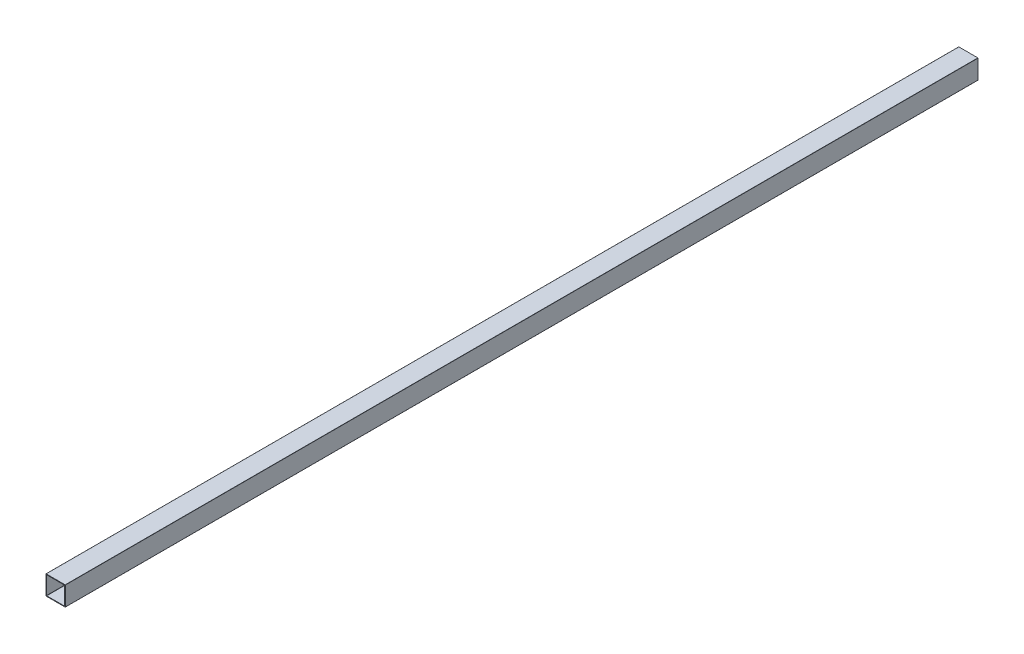
ISO-10303-21;
HEADER;
FILE_DESCRIPTION(('STEP AP214'),'2;1');
FILE_NAME('part.step','',(''),(''),'','','');
FILE_SCHEMA(('AUTOMOTIVE_DESIGN { 1 0 10303 214 1 1 1 1 }'));
ENDSEC;
DATA;
#1=APPLICATION_CONTEXT('core data for automotive mechanical design processes');
#2=APPLICATION_PROTOCOL_DEFINITION('international standard','automotive_design',2000,#1);
#3=PRODUCT_CONTEXT('',#1,'mechanical');
#4=PRODUCT('Part','Part','',(#3));
#5=PRODUCT_RELATED_PRODUCT_CATEGORY('part','',(#4));
#6=PRODUCT_DEFINITION_FORMATION('','',#4);
#7=PRODUCT_DEFINITION_CONTEXT('part definition',#1,'design');
#8=PRODUCT_DEFINITION('design','',#6,#7);
#9=PRODUCT_DEFINITION_SHAPE('','',#8);
#10=(LENGTH_UNIT() NAMED_UNIT(*) SI_UNIT(.MILLI.,.METRE.));
#11=(NAMED_UNIT(*) PLANE_ANGLE_UNIT() SI_UNIT($,.RADIAN.));
#12=(NAMED_UNIT(*) SI_UNIT($,.STERADIAN.) SOLID_ANGLE_UNIT());
#13=UNCERTAINTY_MEASURE_WITH_UNIT(LENGTH_MEASURE(1.E-05),#10,'distance_accuracy_value','');
#14=(GEOMETRIC_REPRESENTATION_CONTEXT(3) GLOBAL_UNCERTAINTY_ASSIGNED_CONTEXT((#13)) GLOBAL_UNIT_ASSIGNED_CONTEXT((#10,
#11,#12)) REPRESENTATION_CONTEXT('',''));
#15=CARTESIAN_POINT('',(0.,0.,0.));
#16=DIRECTION('',(0.,0.,1.));
#17=DIRECTION('',(1.,0.,0.));
#18=AXIS2_PLACEMENT_3D('',#15,#16,#17);
#19=CARTESIAN_POINT('',(63.5,-63.5,-6000.));
#20=DIRECTION('',(1.,0.,0.));
#21=DIRECTION('',(0.,0.,-1.));
#22=AXIS2_PLACEMENT_3D('',#19,#20,#21);
#23=PLANE('',#22);
#24=DIRECTION('',(0.,1.,0.));
#25=VECTOR('',#24,1.);
#26=CARTESIAN_POINT('',(63.5,-63.5,0.));
#27=LINE('',#26,#25);
#28=CARTESIAN_POINT('',(63.5,-62.5,0.));
#29=VERTEX_POINT('',#28);
#30=CARTESIAN_POINT('',(63.5,62.5,0.));
#31=VERTEX_POINT('',#30);
#32=EDGE_CURVE('E197',#29,#31,#27,.T.);
#33=ORIENTED_EDGE('',*,*,#32,.F.);
#34=DIRECTION('',(0.,0.,1.));
#35=VECTOR('',#34,1.);
#36=CARTESIAN_POINT('',(63.5,-62.5,-6000.));
#37=LINE('',#36,#35);
#38=CARTESIAN_POINT('',(63.5,-62.5,-6000.));
#39=VERTEX_POINT('',#38);
#40=EDGE_CURVE('E158',#29,#39,#37,.F.);
#41=ORIENTED_EDGE('',*,*,#40,.T.);
#42=DIRECTION('',(0.,1.,0.));
#43=VECTOR('',#42,1.);
#44=CARTESIAN_POINT('',(63.5,-63.5,-6000.));
#45=LINE('',#44,#43);
#46=CARTESIAN_POINT('',(63.5,62.5,-6000.));
#47=VERTEX_POINT('',#46);
#48=EDGE_CURVE('E185',#39,#47,#45,.T.);
#49=ORIENTED_EDGE('',*,*,#48,.T.);
#50=DIRECTION('',(0.,0.,1.));
#51=VECTOR('',#50,1.);
#52=CARTESIAN_POINT('',(63.5,62.5,-6000.));
#53=LINE('',#52,#51);
#54=EDGE_CURVE('E251',#47,#31,#53,.T.);
#55=ORIENTED_EDGE('',*,*,#54,.T.);
#56=EDGE_LOOP('',(#33,#41,#49,#55));
#57=FACE_BOUND('',#56,.T.);
#58=ADVANCED_FACE('F33',(#57),#23,.T.);
#59=CARTESIAN_POINT('',(-63.5,-63.5,-6000.));
#60=DIRECTION('',(0.,-1.,0.));
#61=DIRECTION('',(0.,0.,-1.));
#62=AXIS2_PLACEMENT_3D('',#59,#60,#61);
#63=PLANE('',#62);
#64=DIRECTION('',(1.,0.,0.));
#65=VECTOR('',#64,1.);
#66=CARTESIAN_POINT('',(-63.5,-63.5,0.));
#67=LINE('',#66,#65);
#68=CARTESIAN_POINT('',(-62.5,-63.5,0.));
#69=VERTEX_POINT('',#68);
#70=CARTESIAN_POINT('',(62.5,-63.5,0.));
#71=VERTEX_POINT('',#70);
#72=EDGE_CURVE('E189',#69,#71,#67,.T.);
#73=ORIENTED_EDGE('',*,*,#72,.F.);
#74=DIRECTION('',(0.,0.,1.));
#75=VECTOR('',#74,1.);
#76=CARTESIAN_POINT('',(-62.5,-63.5,-6000.));
#77=LINE('',#76,#75);
#78=CARTESIAN_POINT('',(-62.5,-63.5,-6000.));
#79=VERTEX_POINT('',#78);
#80=EDGE_CURVE('E238',#69,#79,#77,.F.);
#81=ORIENTED_EDGE('',*,*,#80,.T.);
#82=DIRECTION('',(1.,0.,0.));
#83=VECTOR('',#82,1.);
#84=CARTESIAN_POINT('',(-63.5,-63.5,-6000.));
#85=LINE('',#84,#83);
#86=CARTESIAN_POINT('',(62.5,-63.5,-6000.));
#87=VERTEX_POINT('',#86);
#88=EDGE_CURVE('E194',#79,#87,#85,.T.);
#89=ORIENTED_EDGE('',*,*,#88,.T.);
#90=DIRECTION('',(0.,0.,1.));
#91=VECTOR('',#90,1.);
#92=CARTESIAN_POINT('',(62.5,-63.5,-6000.));
#93=LINE('',#92,#91);
#94=EDGE_CURVE('E235',#87,#71,#93,.T.);
#95=ORIENTED_EDGE('',*,*,#94,.T.);
#96=EDGE_LOOP('',(#73,#81,#89,#95));
#97=FACE_BOUND('',#96,.T.);
#98=ADVANCED_FACE('F305',(#97),#63,.T.);
#99=CARTESIAN_POINT('',(-63.5,-63.5,-6000.));
#100=DIRECTION('',(-1.,0.,0.));
#101=DIRECTION('',(0.,0.,1.));
#102=AXIS2_PLACEMENT_3D('',#99,#100,#101);
#103=PLANE('',#102);
#104=DIRECTION('',(0.,-1.,0.));
#105=VECTOR('',#104,1.);
#106=CARTESIAN_POINT('',(-63.5,-63.5,-6000.));
#107=LINE('',#106,#105);
#108=CARTESIAN_POINT('',(-63.5,62.5,-6000.));
#109=VERTEX_POINT('',#108);
#110=CARTESIAN_POINT('',(-63.5,-62.5,-6000.));
#111=VERTEX_POINT('',#110);
#112=EDGE_CURVE('E191',#109,#111,#107,.T.);
#113=ORIENTED_EDGE('',*,*,#112,.T.);
#114=DIRECTION('',(0.,0.,1.));
#115=VECTOR('',#114,1.);
#116=CARTESIAN_POINT('',(-63.5,-62.5,-6000.));
#117=LINE('',#116,#115);
#118=CARTESIAN_POINT('',(-63.5,-62.5,0.));
#119=VERTEX_POINT('',#118);
#120=EDGE_CURVE('E224',#111,#119,#117,.T.);
#121=ORIENTED_EDGE('',*,*,#120,.T.);
#122=DIRECTION('',(0.,-1.,0.));
#123=VECTOR('',#122,1.);
#124=CARTESIAN_POINT('',(-63.5,-63.5,0.));
#125=LINE('',#124,#123);
#126=CARTESIAN_POINT('',(-63.5,62.5,0.));
#127=VERTEX_POINT('',#126);
#128=EDGE_CURVE('E203',#127,#119,#125,.T.);
#129=ORIENTED_EDGE('',*,*,#128,.F.);
#130=DIRECTION('',(0.,0.,1.));
#131=VECTOR('',#130,1.);
#132=CARTESIAN_POINT('',(-63.5,62.5,-6000.));
#133=LINE('',#132,#131);
#134=EDGE_CURVE('E222',#127,#109,#133,.F.);
#135=ORIENTED_EDGE('',*,*,#134,.T.);
#136=EDGE_LOOP('',(#113,#121,#129,#135));
#137=FACE_BOUND('',#136,.T.);
#138=ADVANCED_FACE('F311',(#137),#103,.T.);
#139=CARTESIAN_POINT('',(-63.5,63.5,-6000.));
#140=DIRECTION('',(0.,1.,0.));
#141=DIRECTION('',(0.,0.,1.));
#142=AXIS2_PLACEMENT_3D('',#139,#140,#141);
#143=PLANE('',#142);
#144=DIRECTION('',(-1.,0.,0.));
#145=VECTOR('',#144,1.);
#146=CARTESIAN_POINT('',(-63.5,63.5,-6000.));
#147=LINE('',#146,#145);
#148=CARTESIAN_POINT('',(62.5,63.5,-6000.));
#149=VERTEX_POINT('',#148);
#150=CARTESIAN_POINT('',(-62.5,63.5,-6000.));
#151=VERTEX_POINT('',#150);
#152=EDGE_CURVE('E188',#149,#151,#147,.T.);
#153=ORIENTED_EDGE('',*,*,#152,.T.);
#154=DIRECTION('',(0.,0.,1.));
#155=VECTOR('',#154,1.);
#156=CARTESIAN_POINT('',(-62.5,63.5,-6000.));
#157=LINE('',#156,#155);
#158=CARTESIAN_POINT('',(-62.5,63.5,0.));
#159=VERTEX_POINT('',#158);
#160=EDGE_CURVE('E248',#151,#159,#157,.T.);
#161=ORIENTED_EDGE('',*,*,#160,.T.);
#162=DIRECTION('',(-1.,0.,0.));
#163=VECTOR('',#162,1.);
#164=CARTESIAN_POINT('',(-63.5,63.5,0.));
#165=LINE('',#164,#163);
#166=CARTESIAN_POINT('',(62.5,63.5,0.));
#167=VERTEX_POINT('',#166);
#168=EDGE_CURVE('E200',#167,#159,#165,.T.);
#169=ORIENTED_EDGE('',*,*,#168,.F.);
#170=DIRECTION('',(0.,0.,1.));
#171=VECTOR('',#170,1.);
#172=CARTESIAN_POINT('',(62.5,63.5,-6000.));
#173=LINE('',#172,#171);
#174=EDGE_CURVE('E55',#167,#149,#173,.F.);
#175=ORIENTED_EDGE('',*,*,#174,.T.);
#176=EDGE_LOOP('',(#153,#161,#169,#175));
#177=FACE_BOUND('',#176,.T.);
#178=ADVANCED_FACE('F316',(#177),#143,.T.);
#179=CARTESIAN_POINT('',(0.,0.,-6000.));
#180=DIRECTION('',(0.,0.,-1.));
#181=DIRECTION('',(-1.,0.,0.));
#182=AXIS2_PLACEMENT_3D('',#179,#180,#181);
#183=PLANE('',#182);
#184=DIRECTION('',(0.,-1.,0.));
#185=VECTOR('',#184,1.);
#186=CARTESIAN_POINT('',(-59.7,-59.7,-6000.));
#187=LINE('',#186,#185);
#188=CARTESIAN_POINT('',(-59.7,58.7,-6000.));
#189=VERTEX_POINT('',#188);
#190=CARTESIAN_POINT('',(-59.7,-58.7,-6000.));
#191=VERTEX_POINT('',#190);
#192=EDGE_CURVE('E167',#189,#191,#187,.T.);
#193=ORIENTED_EDGE('',*,*,#192,.T.);
#194=CARTESIAN_POINT('',(-58.7,-58.7,-6000.));
#195=DIRECTION('',(0.,0.,-1.));
#196=DIRECTION('',(-1.,0.,0.));
#197=AXIS2_PLACEMENT_3D('',#194,#195,#196);
#198=CIRCLE('',#197,1.);
#199=CARTESIAN_POINT('',(-58.7,-59.7,-6000.));
#200=VERTEX_POINT('',#199);
#201=EDGE_CURVE('E11',#191,#200,#198,.F.);
#202=ORIENTED_EDGE('',*,*,#201,.T.);
#203=DIRECTION('',(1.,0.,0.));
#204=VECTOR('',#203,1.);
#205=CARTESIAN_POINT('',(-59.7,-59.7,-6000.));
#206=LINE('',#205,#204);
#207=CARTESIAN_POINT('',(58.7,-59.7,-6000.));
#208=VERTEX_POINT('',#207);
#209=EDGE_CURVE('E175',#200,#208,#206,.T.);
#210=ORIENTED_EDGE('',*,*,#209,.T.);
#211=CARTESIAN_POINT('',(58.7,-58.7,-6000.));
#212=DIRECTION('',(0.,0.,-1.));
#213=DIRECTION('',(-1.,0.,0.));
#214=AXIS2_PLACEMENT_3D('',#211,#212,#213);
#215=CIRCLE('',#214,1.);
#216=CARTESIAN_POINT('',(59.7,-58.7,-6000.));
#217=VERTEX_POINT('',#216);
#218=EDGE_CURVE('E262',#208,#217,#215,.F.);
#219=ORIENTED_EDGE('',*,*,#218,.T.);
#220=DIRECTION('',(0.,1.,0.));
#221=VECTOR('',#220,1.);
#222=CARTESIAN_POINT('',(59.7,-59.7,-6000.));
#223=LINE('',#222,#221);
#224=CARTESIAN_POINT('',(59.7,58.7,-6000.));
#225=VERTEX_POINT('',#224);
#226=EDGE_CURVE('E179',#217,#225,#223,.T.);
#227=ORIENTED_EDGE('',*,*,#226,.T.);
#228=CARTESIAN_POINT('',(58.7,58.7,-6000.));
#229=DIRECTION('',(0.,0.,-1.));
#230=DIRECTION('',(-1.,0.,0.));
#231=AXIS2_PLACEMENT_3D('',#228,#229,#230);
#232=CIRCLE('',#231,1.);
#233=CARTESIAN_POINT('',(58.7,59.7,-6000.));
#234=VERTEX_POINT('',#233);
#235=EDGE_CURVE('E258',#225,#234,#232,.F.);
#236=ORIENTED_EDGE('',*,*,#235,.T.);
#237=DIRECTION('',(-1.,0.,0.));
#238=VECTOR('',#237,1.);
#239=CARTESIAN_POINT('',(-59.7,59.7,-6000.));
#240=LINE('',#239,#238);
#241=CARTESIAN_POINT('',(-58.7,59.7,-6000.));
#242=VERTEX_POINT('',#241);
#243=EDGE_CURVE('E277',#234,#242,#240,.T.);
#244=ORIENTED_EDGE('',*,*,#243,.T.);
#245=CARTESIAN_POINT('',(-58.7,58.7,-6000.));
#246=DIRECTION('',(0.,0.,-1.));
#247=DIRECTION('',(-1.,0.,0.));
#248=AXIS2_PLACEMENT_3D('',#245,#246,#247);
#249=CIRCLE('',#248,1.);
#250=EDGE_CURVE('E157',#242,#189,#249,.F.);
#251=ORIENTED_EDGE('',*,*,#250,.T.);
#252=EDGE_LOOP('',(#193,#202,#210,#219,#227,#236,#244,#251));
#253=FACE_BOUND('',#252,.T.);
#254=ORIENTED_EDGE('',*,*,#88,.F.);
#255=CARTESIAN_POINT('',(-62.5,-62.5,-6000.));
#256=DIRECTION('',(0.,0.,-1.));
#257=DIRECTION('',(-1.,0.,0.));
#258=AXIS2_PLACEMENT_3D('',#255,#256,#257);
#259=CIRCLE('',#258,1.);
#260=EDGE_CURVE('E245',#79,#111,#259,.T.);
#261=ORIENTED_EDGE('',*,*,#260,.T.);
#262=ORIENTED_EDGE('',*,*,#112,.F.);
#263=CARTESIAN_POINT('',(-62.5,62.5,-6000.));
#264=DIRECTION('',(0.,0.,-1.));
#265=DIRECTION('',(-1.,0.,0.));
#266=AXIS2_PLACEMENT_3D('',#263,#264,#265);
#267=CIRCLE('',#266,1.);
#268=EDGE_CURVE('E48',#109,#151,#267,.T.);
#269=ORIENTED_EDGE('',*,*,#268,.T.);
#270=ORIENTED_EDGE('',*,*,#152,.F.);
#271=CARTESIAN_POINT('',(62.5,62.5,-6000.));
#272=DIRECTION('',(0.,0.,-1.));
#273=DIRECTION('',(-1.,0.,0.));
#274=AXIS2_PLACEMENT_3D('',#271,#272,#273);
#275=CIRCLE('',#274,1.);
#276=EDGE_CURVE('E240',#149,#47,#275,.T.);
#277=ORIENTED_EDGE('',*,*,#276,.T.);
#278=ORIENTED_EDGE('',*,*,#48,.F.);
#279=CARTESIAN_POINT('',(62.5,-62.5,-6000.));
#280=DIRECTION('',(0.,0.,-1.));
#281=DIRECTION('',(-1.,0.,0.));
#282=AXIS2_PLACEMENT_3D('',#279,#280,#281);
#283=CIRCLE('',#282,1.);
#284=EDGE_CURVE('E242',#39,#87,#283,.T.);
#285=ORIENTED_EDGE('',*,*,#284,.T.);
#286=EDGE_LOOP('',(#254,#261,#262,#269,#270,#277,#278,#285));
#287=FACE_BOUND('',#286,.T.);
#288=ADVANCED_FACE('F267',(#253,#287),#183,.T.);
#289=CARTESIAN_POINT('',(0.,0.,0.));
#290=DIRECTION('',(0.,0.,-1.));
#291=DIRECTION('',(-1.,0.,0.));
#292=AXIS2_PLACEMENT_3D('',#289,#290,#291);
#293=PLANE('',#292);
#294=DIRECTION('',(0.,1.,0.));
#295=VECTOR('',#294,1.);
#296=CARTESIAN_POINT('',(59.7,-59.7,0.));
#297=LINE('',#296,#295);
#298=CARTESIAN_POINT('',(59.7,-58.7,0.));
#299=VERTEX_POINT('',#298);
#300=CARTESIAN_POINT('',(59.7,58.7,0.));
#301=VERTEX_POINT('',#300);
#302=EDGE_CURVE('E181',#299,#301,#297,.T.);
#303=ORIENTED_EDGE('',*,*,#302,.F.);
#304=CARTESIAN_POINT('',(58.7,-58.7,0.));
#305=DIRECTION('',(0.,0.,-1.));
#306=DIRECTION('',(-1.,0.,0.));
#307=AXIS2_PLACEMENT_3D('',#304,#305,#306);
#308=CIRCLE('',#307,1.);
#309=CARTESIAN_POINT('',(58.7,-59.7,0.));
#310=VERTEX_POINT('',#309);
#311=EDGE_CURVE('E260',#299,#310,#308,.T.);
#312=ORIENTED_EDGE('',*,*,#311,.T.);
#313=DIRECTION('',(1.,0.,0.));
#314=VECTOR('',#313,1.);
#315=CARTESIAN_POINT('',(-59.7,-59.7,0.));
#316=LINE('',#315,#314);
#317=CARTESIAN_POINT('',(-58.7,-59.7,0.));
#318=VERTEX_POINT('',#317);
#319=EDGE_CURVE('E281',#318,#310,#316,.T.);
#320=ORIENTED_EDGE('',*,*,#319,.F.);
#321=CARTESIAN_POINT('',(-58.7,-58.7,0.));
#322=DIRECTION('',(0.,0.,-1.));
#323=DIRECTION('',(-1.,0.,0.));
#324=AXIS2_PLACEMENT_3D('',#321,#322,#323);
#325=CIRCLE('',#324,1.);
#326=CARTESIAN_POINT('',(-59.7,-58.7,0.));
#327=VERTEX_POINT('',#326);
#328=EDGE_CURVE('E41',#318,#327,#325,.T.);
#329=ORIENTED_EDGE('',*,*,#328,.T.);
#330=DIRECTION('',(0.,-1.,0.));
#331=VECTOR('',#330,1.);
#332=CARTESIAN_POINT('',(-59.7,-59.7,0.));
#333=LINE('',#332,#331);
#334=CARTESIAN_POINT('',(-59.7,58.7,0.));
#335=VERTEX_POINT('',#334);
#336=EDGE_CURVE('E164',#335,#327,#333,.T.);
#337=ORIENTED_EDGE('',*,*,#336,.F.);
#338=CARTESIAN_POINT('',(-58.7,58.7,0.));
#339=DIRECTION('',(0.,0.,-1.));
#340=DIRECTION('',(-1.,0.,0.));
#341=AXIS2_PLACEMENT_3D('',#338,#339,#340);
#342=CIRCLE('',#341,1.);
#343=CARTESIAN_POINT('',(-58.7,59.7,0.));
#344=VERTEX_POINT('',#343);
#345=EDGE_CURVE('E147',#335,#344,#342,.T.);
#346=ORIENTED_EDGE('',*,*,#345,.T.);
#347=DIRECTION('',(-1.,0.,0.));
#348=VECTOR('',#347,1.);
#349=CARTESIAN_POINT('',(-59.7,59.7,0.));
#350=LINE('',#349,#348);
#351=CARTESIAN_POINT('',(58.7,59.7,0.));
#352=VERTEX_POINT('',#351);
#353=EDGE_CURVE('E176',#352,#344,#350,.T.);
#354=ORIENTED_EDGE('',*,*,#353,.F.);
#355=CARTESIAN_POINT('',(58.7,58.7,0.));
#356=DIRECTION('',(0.,0.,-1.));
#357=DIRECTION('',(-1.,0.,0.));
#358=AXIS2_PLACEMENT_3D('',#355,#356,#357);
#359=CIRCLE('',#358,1.);
#360=EDGE_CURVE('E256',#352,#301,#359,.T.);
#361=ORIENTED_EDGE('',*,*,#360,.T.);
#362=EDGE_LOOP('',(#303,#312,#320,#329,#337,#346,#354,#361));
#363=FACE_BOUND('',#362,.T.);
#364=ORIENTED_EDGE('',*,*,#128,.T.);
#365=CARTESIAN_POINT('',(-62.5,-62.5,0.));
#366=DIRECTION('',(0.,0.,-1.));
#367=DIRECTION('',(-1.,0.,0.));
#368=AXIS2_PLACEMENT_3D('',#365,#366,#367);
#369=CIRCLE('',#368,1.);
#370=EDGE_CURVE('E233',#119,#69,#369,.F.);
#371=ORIENTED_EDGE('',*,*,#370,.T.);
#372=ORIENTED_EDGE('',*,*,#72,.T.);
#373=CARTESIAN_POINT('',(62.5,-62.5,0.));
#374=DIRECTION('',(0.,0.,-1.));
#375=DIRECTION('',(-1.,0.,0.));
#376=AXIS2_PLACEMENT_3D('',#373,#374,#375);
#377=CIRCLE('',#376,1.);
#378=EDGE_CURVE('E229',#71,#29,#377,.F.);
#379=ORIENTED_EDGE('',*,*,#378,.T.);
#380=ORIENTED_EDGE('',*,*,#32,.T.);
#381=CARTESIAN_POINT('',(62.5,62.5,0.));
#382=DIRECTION('',(0.,0.,-1.));
#383=DIRECTION('',(-1.,0.,0.));
#384=AXIS2_PLACEMENT_3D('',#381,#382,#383);
#385=CIRCLE('',#384,1.);
#386=EDGE_CURVE('E227',#31,#167,#385,.F.);
#387=ORIENTED_EDGE('',*,*,#386,.T.);
#388=ORIENTED_EDGE('',*,*,#168,.T.);
#389=CARTESIAN_POINT('',(-62.5,62.5,0.));
#390=DIRECTION('',(0.,0.,-1.));
#391=DIRECTION('',(-1.,0.,0.));
#392=AXIS2_PLACEMENT_3D('',#389,#390,#391);
#393=CIRCLE('',#392,1.);
#394=EDGE_CURVE('E231',#159,#127,#393,.F.);
#395=ORIENTED_EDGE('',*,*,#394,.T.);
#396=EDGE_LOOP('',(#364,#371,#372,#379,#380,#387,#388,#395));
#397=FACE_BOUND('',#396,.T.);
#398=ADVANCED_FACE('F172',(#363,#397),#293,.F.);
#399=CARTESIAN_POINT('',(-59.7,-59.7,-6000.));
#400=DIRECTION('',(0.,-1.,0.));
#401=DIRECTION('',(0.,0.,-1.));
#402=AXIS2_PLACEMENT_3D('',#399,#400,#401);
#403=PLANE('',#402);
#404=ORIENTED_EDGE('',*,*,#319,.T.);
#405=DIRECTION('',(0.,0.,1.));
#406=VECTOR('',#405,1.);
#407=CARTESIAN_POINT('',(58.7,-59.7,-6000.));
#408=LINE('',#407,#406);
#409=EDGE_CURVE('E220',#310,#208,#408,.F.);
#410=ORIENTED_EDGE('',*,*,#409,.T.);
#411=ORIENTED_EDGE('',*,*,#209,.F.);
#412=DIRECTION('',(0.,0.,1.));
#413=VECTOR('',#412,1.);
#414=CARTESIAN_POINT('',(-58.7,-59.7,0.));
#415=LINE('',#414,#413);
#416=EDGE_CURVE('E217',#200,#318,#415,.T.);
#417=ORIENTED_EDGE('',*,*,#416,.T.);
#418=EDGE_LOOP('',(#404,#410,#411,#417));
#419=FACE_BOUND('',#418,.T.);
#420=ADVANCED_FACE('F283',(#419),#403,.F.);
#421=CARTESIAN_POINT('',(-59.7,-59.7,-6000.));
#422=DIRECTION('',(-1.,0.,0.));
#423=DIRECTION('',(0.,0.,1.));
#424=AXIS2_PLACEMENT_3D('',#421,#422,#423);
#425=PLANE('',#424);
#426=ORIENTED_EDGE('',*,*,#192,.F.);
#427=DIRECTION('',(0.,0.,1.));
#428=VECTOR('',#427,1.);
#429=CARTESIAN_POINT('',(-59.7,58.7,0.));
#430=LINE('',#429,#428);
#431=EDGE_CURVE('E151',#189,#335,#430,.T.);
#432=ORIENTED_EDGE('',*,*,#431,.T.);
#433=ORIENTED_EDGE('',*,*,#336,.T.);
#434=DIRECTION('',(0.,0.,1.));
#435=VECTOR('',#434,1.);
#436=CARTESIAN_POINT('',(-59.7,-58.7,-6000.));
#437=LINE('',#436,#435);
#438=EDGE_CURVE('E169',#327,#191,#437,.F.);
#439=ORIENTED_EDGE('',*,*,#438,.T.);
#440=EDGE_LOOP('',(#426,#432,#433,#439));
#441=FACE_BOUND('',#440,.T.);
#442=ADVANCED_FACE('F163',(#441),#425,.F.);
#443=CARTESIAN_POINT('',(-59.7,59.7,-6000.));
#444=DIRECTION('',(0.,1.,0.));
#445=DIRECTION('',(0.,0.,1.));
#446=AXIS2_PLACEMENT_3D('',#443,#444,#445);
#447=PLANE('',#446);
#448=ORIENTED_EDGE('',*,*,#353,.T.);
#449=DIRECTION('',(0.,0.,1.));
#450=VECTOR('',#449,1.);
#451=CARTESIAN_POINT('',(-58.7,59.7,-6000.));
#452=LINE('',#451,#450);
#453=EDGE_CURVE('E152',#344,#242,#452,.F.);
#454=ORIENTED_EDGE('',*,*,#453,.T.);
#455=ORIENTED_EDGE('',*,*,#243,.F.);
#456=DIRECTION('',(0.,0.,1.));
#457=VECTOR('',#456,1.);
#458=CARTESIAN_POINT('',(58.7,59.7,0.));
#459=LINE('',#458,#457);
#460=EDGE_CURVE('E168',#234,#352,#459,.T.);
#461=ORIENTED_EDGE('',*,*,#460,.T.);
#462=EDGE_LOOP('',(#448,#454,#455,#461));
#463=FACE_BOUND('',#462,.T.);
#464=ADVANCED_FACE('F292',(#463),#447,.F.);
#465=CARTESIAN_POINT('',(59.7,-59.7,-6000.));
#466=DIRECTION('',(1.,0.,0.));
#467=DIRECTION('',(0.,0.,-1.));
#468=AXIS2_PLACEMENT_3D('',#465,#466,#467);
#469=PLANE('',#468);
#470=ORIENTED_EDGE('',*,*,#302,.T.);
#471=DIRECTION('',(0.,0.,1.));
#472=VECTOR('',#471,1.);
#473=CARTESIAN_POINT('',(59.7,58.7,-6000.));
#474=LINE('',#473,#472);
#475=EDGE_CURVE('E215',#301,#225,#474,.F.);
#476=ORIENTED_EDGE('',*,*,#475,.T.);
#477=ORIENTED_EDGE('',*,*,#226,.F.);
#478=DIRECTION('',(0.,0.,1.));
#479=VECTOR('',#478,1.);
#480=CARTESIAN_POINT('',(59.7,-58.7,0.));
#481=LINE('',#480,#479);
#482=EDGE_CURVE('E212',#217,#299,#481,.T.);
#483=ORIENTED_EDGE('',*,*,#482,.T.);
#484=EDGE_LOOP('',(#470,#476,#477,#483));
#485=FACE_BOUND('',#484,.T.);
#486=ADVANCED_FACE('F275',(#485),#469,.F.);
#487=CARTESIAN_POINT('',(-58.7,58.7,-6000.));
#488=DIRECTION('',(0.,0.,-1.));
#489=DIRECTION('',(-1.,0.,0.));
#490=AXIS2_PLACEMENT_3D('',#487,#488,#489);
#491=CYLINDRICAL_SURFACE('',#490,1.);
#492=ORIENTED_EDGE('',*,*,#250,.F.);
#493=ORIENTED_EDGE('',*,*,#453,.F.);
#494=ORIENTED_EDGE('',*,*,#345,.F.);
#495=ORIENTED_EDGE('',*,*,#431,.F.);
#496=EDGE_LOOP('',(#492,#493,#494,#495));
#497=FACE_BOUND('',#496,.T.);
#498=ADVANCED_FACE('F150',(#497),#491,.F.);
#499=CARTESIAN_POINT('',(58.7,58.7,-6000.));
#500=DIRECTION('',(0.,0.,-1.));
#501=DIRECTION('',(-1.,0.,0.));
#502=AXIS2_PLACEMENT_3D('',#499,#500,#501);
#503=CYLINDRICAL_SURFACE('',#502,1.);
#504=ORIENTED_EDGE('',*,*,#235,.F.);
#505=ORIENTED_EDGE('',*,*,#475,.F.);
#506=ORIENTED_EDGE('',*,*,#360,.F.);
#507=ORIENTED_EDGE('',*,*,#460,.F.);
#508=EDGE_LOOP('',(#504,#505,#506,#507));
#509=FACE_BOUND('',#508,.T.);
#510=ADVANCED_FACE('F294',(#509),#503,.F.);
#511=CARTESIAN_POINT('',(58.7,-58.7,-6000.));
#512=DIRECTION('',(0.,0.,-1.));
#513=DIRECTION('',(-1.,0.,0.));
#514=AXIS2_PLACEMENT_3D('',#511,#512,#513);
#515=CYLINDRICAL_SURFACE('',#514,1.);
#516=ORIENTED_EDGE('',*,*,#218,.F.);
#517=ORIENTED_EDGE('',*,*,#409,.F.);
#518=ORIENTED_EDGE('',*,*,#311,.F.);
#519=ORIENTED_EDGE('',*,*,#482,.F.);
#520=EDGE_LOOP('',(#516,#517,#518,#519));
#521=FACE_BOUND('',#520,.T.);
#522=ADVANCED_FACE('F279',(#521),#515,.F.);
#523=CARTESIAN_POINT('',(-62.5,-62.5,-6000.));
#524=DIRECTION('',(0.,0.,1.));
#525=DIRECTION('',(1.,0.,0.));
#526=AXIS2_PLACEMENT_3D('',#523,#524,#525);
#527=CYLINDRICAL_SURFACE('',#526,1.);
#528=ORIENTED_EDGE('',*,*,#260,.F.);
#529=ORIENTED_EDGE('',*,*,#80,.F.);
#530=ORIENTED_EDGE('',*,*,#370,.F.);
#531=ORIENTED_EDGE('',*,*,#120,.F.);
#532=EDGE_LOOP('',(#528,#529,#530,#531));
#533=FACE_BOUND('',#532,.T.);
#534=ADVANCED_FACE('F301',(#533),#527,.T.);
#535=CARTESIAN_POINT('',(-62.5,62.5,-6000.));
#536=DIRECTION('',(0.,0.,1.));
#537=DIRECTION('',(1.,0.,0.));
#538=AXIS2_PLACEMENT_3D('',#535,#536,#537);
#539=CYLINDRICAL_SURFACE('',#538,1.);
#540=ORIENTED_EDGE('',*,*,#268,.F.);
#541=ORIENTED_EDGE('',*,*,#134,.F.);
#542=ORIENTED_EDGE('',*,*,#394,.F.);
#543=ORIENTED_EDGE('',*,*,#160,.F.);
#544=EDGE_LOOP('',(#540,#541,#542,#543));
#545=FACE_BOUND('',#544,.T.);
#546=ADVANCED_FACE('F368',(#545),#539,.T.);
#547=CARTESIAN_POINT('',(-58.7,-58.7,-6000.));
#548=DIRECTION('',(0.,0.,-1.));
#549=DIRECTION('',(-1.,0.,0.));
#550=AXIS2_PLACEMENT_3D('',#547,#548,#549);
#551=CYLINDRICAL_SURFACE('',#550,1.);
#552=ORIENTED_EDGE('',*,*,#201,.F.);
#553=ORIENTED_EDGE('',*,*,#438,.F.);
#554=ORIENTED_EDGE('',*,*,#328,.F.);
#555=ORIENTED_EDGE('',*,*,#416,.F.);
#556=EDGE_LOOP('',(#552,#553,#554,#555));
#557=FACE_BOUND('',#556,.T.);
#558=ADVANCED_FACE('F378',(#557),#551,.F.);
#559=CARTESIAN_POINT('',(62.5,-62.5,-6000.));
#560=DIRECTION('',(0.,0.,1.));
#561=DIRECTION('',(1.,0.,0.));
#562=AXIS2_PLACEMENT_3D('',#559,#560,#561);
#563=CYLINDRICAL_SURFACE('',#562,1.);
#564=ORIENTED_EDGE('',*,*,#284,.F.);
#565=ORIENTED_EDGE('',*,*,#40,.F.);
#566=ORIENTED_EDGE('',*,*,#378,.F.);
#567=ORIENTED_EDGE('',*,*,#94,.F.);
#568=EDGE_LOOP('',(#564,#565,#566,#567));
#569=FACE_BOUND('',#568,.T.);
#570=ADVANCED_FACE('F388',(#569),#563,.T.);
#571=CARTESIAN_POINT('',(62.5,62.5,-6000.));
#572=DIRECTION('',(0.,0.,1.));
#573=DIRECTION('',(1.,0.,0.));
#574=AXIS2_PLACEMENT_3D('',#571,#572,#573);
#575=CYLINDRICAL_SURFACE('',#574,1.);
#576=ORIENTED_EDGE('',*,*,#276,.F.);
#577=ORIENTED_EDGE('',*,*,#174,.F.);
#578=ORIENTED_EDGE('',*,*,#386,.F.);
#579=ORIENTED_EDGE('',*,*,#54,.F.);
#580=EDGE_LOOP('',(#576,#577,#578,#579));
#581=FACE_BOUND('',#580,.T.);
#582=ADVANCED_FACE('F35',(#581),#575,.T.);
#583=CLOSED_SHELL('',(#58,#98,#138,#178,#288,#398,#420,#442,#464,#486,#498,#510,#522,#534,#546,
#558,#570,#582));
#584=MANIFOLD_SOLID_BREP('B2',#583);
#585=ADVANCED_BREP_SHAPE_REPRESENTATION('',(#18,#584),#14);
#586=SHAPE_DEFINITION_REPRESENTATION(#9,#585);
ENDSEC;
END-ISO-10303-21;
